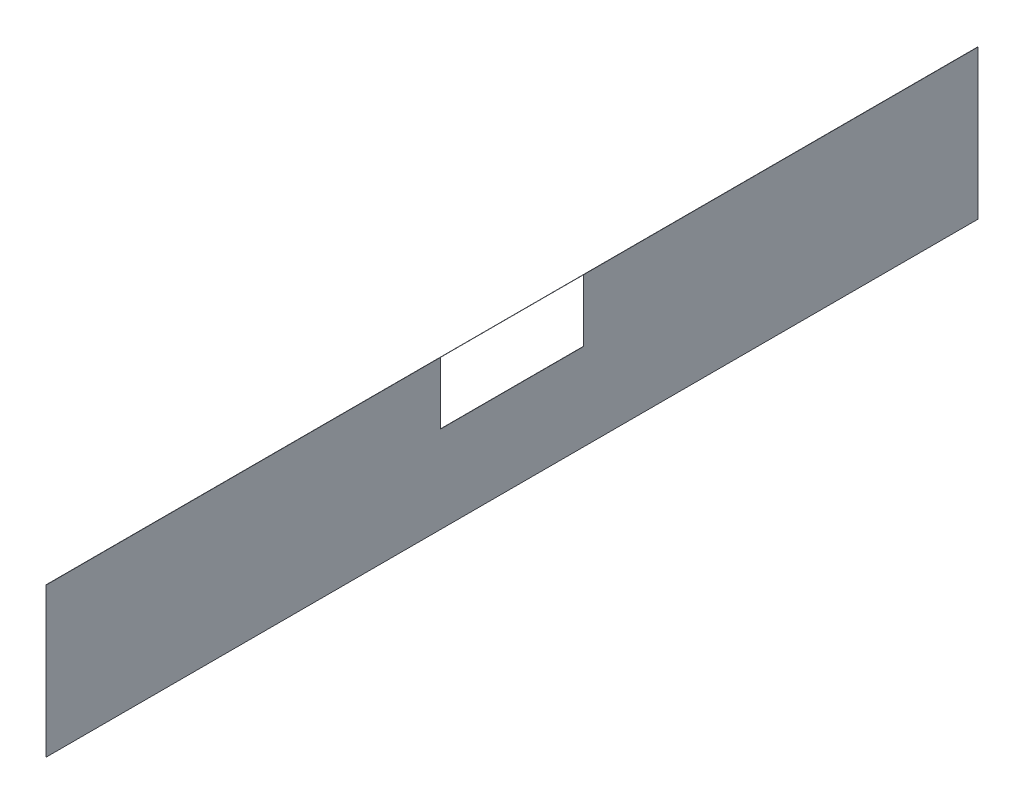
ISO-10303-21;
HEADER;
FILE_DESCRIPTION(('STEP AP214'),'2;1');
FILE_NAME('part.step','',(''),(''),'','','');
FILE_SCHEMA(('AUTOMOTIVE_DESIGN { 1 0 10303 214 1 1 1 1 }'));
ENDSEC;
DATA;
#1=APPLICATION_CONTEXT('core data for automotive mechanical design processes');
#2=APPLICATION_PROTOCOL_DEFINITION('international standard','automotive_design',2000,#1);
#3=PRODUCT_CONTEXT('',#1,'mechanical');
#4=PRODUCT('Part','Part','',(#3));
#5=PRODUCT_RELATED_PRODUCT_CATEGORY('part','',(#4));
#6=PRODUCT_DEFINITION_FORMATION('','',#4);
#7=PRODUCT_DEFINITION_CONTEXT('part definition',#1,'design');
#8=PRODUCT_DEFINITION('design','',#6,#7);
#9=PRODUCT_DEFINITION_SHAPE('','',#8);
#10=(LENGTH_UNIT() NAMED_UNIT(*) SI_UNIT(.MILLI.,.METRE.));
#11=(NAMED_UNIT(*) PLANE_ANGLE_UNIT() SI_UNIT($,.RADIAN.));
#12=(NAMED_UNIT(*) SI_UNIT($,.STERADIAN.) SOLID_ANGLE_UNIT());
#13=UNCERTAINTY_MEASURE_WITH_UNIT(LENGTH_MEASURE(1.E-05),#10,'distance_accuracy_value','');
#14=(GEOMETRIC_REPRESENTATION_CONTEXT(3) GLOBAL_UNCERTAINTY_ASSIGNED_CONTEXT((#13)) GLOBAL_UNIT_ASSIGNED_CONTEXT((#10,
#11,#12)) REPRESENTATION_CONTEXT('',''));
#15=CARTESIAN_POINT('',(0.,0.,0.));
#16=DIRECTION('',(0.,0.,1.));
#17=DIRECTION('',(1.,0.,0.));
#18=AXIS2_PLACEMENT_3D('',#15,#16,#17);
#19=CARTESIAN_POINT('',(-125.4032,60.,-150.));
#20=DIRECTION('',(0.,0.,-1.));
#21=DIRECTION('',(-1.,0.,0.));
#22=AXIS2_PLACEMENT_3D('',#19,#20,#21);
#23=PLANE('',#22);
#24=DIRECTION('',(1.,0.,0.));
#25=VECTOR('',#24,1.);
#26=CARTESIAN_POINT('',(-135.327,12.,-150.));
#27=LINE('',#26,#25);
#28=CARTESIAN_POINT('',(-125.4032,12.,-150.));
#29=VERTEX_POINT('',#28);
#30=CARTESIAN_POINT('',(-125.327,12.,-150.));
#31=VERTEX_POINT('',#30);
#32=EDGE_CURVE('E139',#29,#31,#27,.T.);
#33=ORIENTED_EDGE('',*,*,#32,.F.);
#34=DIRECTION('',(0.,1.,-2.77555756156204E-12));
#35=VECTOR('',#34,1.);
#36=CARTESIAN_POINT('',(-125.4032,60.01,-150.));
#37=LINE('',#36,#35);
#38=CARTESIAN_POINT('',(-125.4032,60.01,-150.));
#39=VERTEX_POINT('',#38);
#40=EDGE_CURVE('E148',#29,#39,#37,.T.);
#41=ORIENTED_EDGE('',*,*,#40,.T.);
#42=DIRECTION('',(1.,0.,0.));
#43=VECTOR('',#42,1.);
#44=CARTESIAN_POINT('',(-125.4032,60.01,-150.));
#45=LINE('',#44,#43);
#46=CARTESIAN_POINT('',(-125.327,60.01,-150.));
#47=VERTEX_POINT('',#46);
#48=EDGE_CURVE('E157',#39,#47,#45,.T.);
#49=ORIENTED_EDGE('',*,*,#48,.T.);
#50=DIRECTION('',(0.,1.,0.));
#51=VECTOR('',#50,1.);
#52=CARTESIAN_POINT('',(-125.327,60.,-150.));
#53=LINE('',#52,#51);
#54=EDGE_CURVE('E151',#31,#47,#53,.T.);
#55=ORIENTED_EDGE('',*,*,#54,.F.);
#56=EDGE_LOOP('',(#33,#41,#49,#55));
#57=FACE_BOUND('',#56,.T.);
#58=ADVANCED_FACE('F45',(#57),#23,.T.);
#59=CARTESIAN_POINT('',(-125.4032,60.,150.));
#60=DIRECTION('',(0.,0.,1.));
#61=DIRECTION('',(1.,0.,0.));
#62=AXIS2_PLACEMENT_3D('',#59,#60,#61);
#63=PLANE('',#62);
#64=DIRECTION('',(1.,0.,0.));
#65=VECTOR('',#64,1.);
#66=CARTESIAN_POINT('',(-135.327,12.,150.));
#67=LINE('',#66,#65);
#68=CARTESIAN_POINT('',(-125.4032,12.,150.));
#69=VERTEX_POINT('',#68);
#70=CARTESIAN_POINT('',(-125.327,12.,150.));
#71=VERTEX_POINT('',#70);
#72=EDGE_CURVE('E140',#69,#71,#67,.T.);
#73=ORIENTED_EDGE('',*,*,#72,.T.);
#74=DIRECTION('',(0.,-1.,0.));
#75=VECTOR('',#74,1.);
#76=CARTESIAN_POINT('',(-125.327,60.,150.));
#77=LINE('',#76,#75);
#78=CARTESIAN_POINT('',(-125.327,60.01,150.));
#79=VERTEX_POINT('',#78);
#80=EDGE_CURVE('E160',#79,#71,#77,.T.);
#81=ORIENTED_EDGE('',*,*,#80,.F.);
#82=DIRECTION('',(1.,0.,0.));
#83=VECTOR('',#82,1.);
#84=CARTESIAN_POINT('',(-125.4032,60.01,150.));
#85=LINE('',#84,#83);
#86=CARTESIAN_POINT('',(-125.4032,60.01,150.));
#87=VERTEX_POINT('',#86);
#88=EDGE_CURVE('E164',#87,#79,#85,.T.);
#89=ORIENTED_EDGE('',*,*,#88,.F.);
#90=DIRECTION('',(0.,-1.,0.));
#91=VECTOR('',#90,1.);
#92=CARTESIAN_POINT('',(-125.4032,60.,150.));
#93=LINE('',#92,#91);
#94=EDGE_CURVE('E154',#87,#69,#93,.T.);
#95=ORIENTED_EDGE('',*,*,#94,.T.);
#96=EDGE_LOOP('',(#73,#81,#89,#95));
#97=FACE_BOUND('',#96,.T.);
#98=ADVANCED_FACE('F193',(#97),#63,.T.);
#99=CARTESIAN_POINT('',(-125.4032,60.01,150.));
#100=DIRECTION('',(0.,1.,0.));
#101=DIRECTION('',(0.,0.,1.));
#102=AXIS2_PLACEMENT_3D('',#99,#100,#101);
#103=PLANE('',#102);
#104=DIRECTION('',(0.,0.,1.));
#105=VECTOR('',#104,1.);
#106=CARTESIAN_POINT('',(-125.327,60.01,150.));
#107=LINE('',#106,#105);
#108=EDGE_CURVE('E147',#47,#79,#107,.T.);
#109=ORIENTED_EDGE('',*,*,#108,.F.);
#110=ORIENTED_EDGE('',*,*,#48,.F.);
#111=DIRECTION('',(0.,0.,1.));
#112=VECTOR('',#111,1.);
#113=CARTESIAN_POINT('',(-125.4032,60.01,150.));
#114=LINE('',#113,#112);
#115=EDGE_CURVE('E150',#39,#87,#114,.T.);
#116=ORIENTED_EDGE('',*,*,#115,.T.);
#117=ORIENTED_EDGE('',*,*,#88,.T.);
#118=EDGE_LOOP('',(#109,#110,#116,#117));
#119=FACE_BOUND('',#118,.T.);
#120=ADVANCED_FACE('F47',(#119),#103,.T.);
#121=CARTESIAN_POINT('',(-125.4032,0.,0.));
#122=DIRECTION('',(1.,0.,0.));
#123=DIRECTION('',(0.,0.,-1.));
#124=AXIS2_PLACEMENT_3D('',#121,#122,#123);
#125=PLANE('',#124);
#126=DIRECTION('',(0.,1.,0.));
#127=VECTOR('',#126,1.);
#128=CARTESIAN_POINT('',(-125.4032,40.001,23.));
#129=LINE('',#128,#127);
#130=CARTESIAN_POINT('',(-125.4032,40.001,23.));
#131=VERTEX_POINT('',#130);
#132=CARTESIAN_POINT('',(-125.4032,60.001,23.));
#133=VERTEX_POINT('',#132);
#134=EDGE_CURVE('E121',#131,#133,#129,.T.);
#135=ORIENTED_EDGE('',*,*,#134,.F.);
#136=DIRECTION('',(0.,0.,1.));
#137=VECTOR('',#136,1.);
#138=CARTESIAN_POINT('',(-125.4032,40.001,-23.));
#139=LINE('',#138,#137);
#140=CARTESIAN_POINT('',(-125.4032,40.001,-23.));
#141=VERTEX_POINT('',#140);
#142=EDGE_CURVE('E60',#141,#131,#139,.T.);
#143=ORIENTED_EDGE('',*,*,#142,.F.);
#144=DIRECTION('',(0.,-1.,0.));
#145=VECTOR('',#144,1.);
#146=CARTESIAN_POINT('',(-125.4032,60.001,-23.));
#147=LINE('',#146,#145);
#148=CARTESIAN_POINT('',(-125.4032,60.001,-23.));
#149=VERTEX_POINT('',#148);
#150=EDGE_CURVE('E128',#149,#141,#147,.T.);
#151=ORIENTED_EDGE('',*,*,#150,.F.);
#152=DIRECTION('',(0.,0.,-1.));
#153=VECTOR('',#152,1.);
#154=CARTESIAN_POINT('',(-125.4032,60.001,-23.));
#155=LINE('',#154,#153);
#156=EDGE_CURVE('E112',#133,#149,#155,.T.);
#157=ORIENTED_EDGE('',*,*,#156,.F.);
#158=EDGE_LOOP('',(#135,#143,#151,#157));
#159=FACE_BOUND('',#158,.T.);
#160=ORIENTED_EDGE('',*,*,#40,.F.);
#161=DIRECTION('',(0.,0.,1.));
#162=VECTOR('',#161,1.);
#163=CARTESIAN_POINT('',(-125.4032,12.,0.));
#164=LINE('',#163,#162);
#165=EDGE_CURVE('E143',#29,#69,#164,.T.);
#166=ORIENTED_EDGE('',*,*,#165,.T.);
#167=ORIENTED_EDGE('',*,*,#94,.F.);
#168=ORIENTED_EDGE('',*,*,#115,.F.);
#169=EDGE_LOOP('',(#160,#166,#167,#168));
#170=FACE_BOUND('',#169,.T.);
#171=ADVANCED_FACE('F125',(#159,#170),#125,.F.);
#172=CARTESIAN_POINT('',(-125.327,0.,0.));
#173=DIRECTION('',(1.,0.,0.));
#174=DIRECTION('',(0.,0.,-1.));
#175=AXIS2_PLACEMENT_3D('',#172,#173,#174);
#176=PLANE('',#175);
#177=DIRECTION('',(0.,0.,-1.));
#178=VECTOR('',#177,1.);
#179=CARTESIAN_POINT('',(-125.327,40.001,0.));
#180=LINE('',#179,#178);
#181=CARTESIAN_POINT('',(-125.327,40.001,23.));
#182=VERTEX_POINT('',#181);
#183=CARTESIAN_POINT('',(-125.327,40.001,-23.));
#184=VERTEX_POINT('',#183);
#185=EDGE_CURVE('E11',#182,#184,#180,.T.);
#186=ORIENTED_EDGE('',*,*,#185,.F.);
#187=DIRECTION('',(0.,-1.,0.));
#188=VECTOR('',#187,1.);
#189=CARTESIAN_POINT('',(-125.327,0.,23.));
#190=LINE('',#189,#188);
#191=CARTESIAN_POINT('',(-125.327,60.001,23.));
#192=VERTEX_POINT('',#191);
#193=EDGE_CURVE('E167',#192,#182,#190,.T.);
#194=ORIENTED_EDGE('',*,*,#193,.F.);
#195=DIRECTION('',(0.,0.,1.));
#196=VECTOR('',#195,1.);
#197=CARTESIAN_POINT('',(-125.327,60.001,0.));
#198=LINE('',#197,#196);
#199=CARTESIAN_POINT('',(-125.327,60.001,-23.));
#200=VERTEX_POINT('',#199);
#201=EDGE_CURVE('E115',#200,#192,#198,.T.);
#202=ORIENTED_EDGE('',*,*,#201,.F.);
#203=DIRECTION('',(0.,1.,0.));
#204=VECTOR('',#203,1.);
#205=CARTESIAN_POINT('',(-125.327,0.,-23.));
#206=LINE('',#205,#204);
#207=EDGE_CURVE('E53',#184,#200,#206,.T.);
#208=ORIENTED_EDGE('',*,*,#207,.F.);
#209=EDGE_LOOP('',(#186,#194,#202,#208));
#210=FACE_BOUND('',#209,.T.);
#211=DIRECTION('',(0.,0.,1.));
#212=VECTOR('',#211,1.);
#213=CARTESIAN_POINT('',(-125.327,12.,150.));
#214=LINE('',#213,#212);
#215=EDGE_CURVE('E135',#31,#71,#214,.T.);
#216=ORIENTED_EDGE('',*,*,#215,.F.);
#217=ORIENTED_EDGE('',*,*,#54,.T.);
#218=ORIENTED_EDGE('',*,*,#108,.T.);
#219=ORIENTED_EDGE('',*,*,#80,.T.);
#220=EDGE_LOOP('',(#216,#217,#218,#219));
#221=FACE_BOUND('',#220,.T.);
#222=ADVANCED_FACE('F177',(#210,#221),#176,.T.);
#223=CARTESIAN_POINT('',(-135.327,12.,150.));
#224=DIRECTION('',(0.,1.,0.));
#225=DIRECTION('',(-1.,0.,0.));
#226=AXIS2_PLACEMENT_3D('',#223,#224,#225);
#227=PLANE('',#226);
#228=ORIENTED_EDGE('',*,*,#32,.T.);
#229=ORIENTED_EDGE('',*,*,#215,.T.);
#230=ORIENTED_EDGE('',*,*,#72,.F.);
#231=ORIENTED_EDGE('',*,*,#165,.F.);
#232=EDGE_LOOP('',(#228,#229,#230,#231));
#233=FACE_BOUND('',#232,.T.);
#234=ADVANCED_FACE('F181',(#233),#227,.F.);
#235=CARTESIAN_POINT('',(-115.4032,40.001,-23.));
#236=DIRECTION('',(0.,-1.,0.));
#237=DIRECTION('',(0.,0.,-1.));
#238=AXIS2_PLACEMENT_3D('',#235,#236,#237);
#239=PLANE('',#238);
#240=ORIENTED_EDGE('',*,*,#185,.T.);
#241=DIRECTION('',(-1.,0.,0.));
#242=VECTOR('',#241,1.);
#243=CARTESIAN_POINT('',(-115.4032,40.001,-23.));
#244=LINE('',#243,#242);
#245=EDGE_CURVE('E133',#184,#141,#244,.T.);
#246=ORIENTED_EDGE('',*,*,#245,.T.);
#247=ORIENTED_EDGE('',*,*,#142,.T.);
#248=DIRECTION('',(-1.,0.,0.));
#249=VECTOR('',#248,1.);
#250=CARTESIAN_POINT('',(-115.4032,40.001,23.));
#251=LINE('',#250,#249);
#252=EDGE_CURVE('E118',#182,#131,#251,.T.);
#253=ORIENTED_EDGE('',*,*,#252,.F.);
#254=EDGE_LOOP('',(#240,#246,#247,#253));
#255=FACE_BOUND('',#254,.T.);
#256=ADVANCED_FACE('F179',(#255),#239,.F.);
#257=CARTESIAN_POINT('',(-115.4032,60.001,-23.));
#258=DIRECTION('',(0.,0.,-1.));
#259=DIRECTION('',(-1.,0.,0.));
#260=AXIS2_PLACEMENT_3D('',#257,#258,#259);
#261=PLANE('',#260);
#262=ORIENTED_EDGE('',*,*,#207,.T.);
#263=DIRECTION('',(-1.,0.,0.));
#264=VECTOR('',#263,1.);
#265=CARTESIAN_POINT('',(-115.4032,60.001,-23.));
#266=LINE('',#265,#264);
#267=EDGE_CURVE('E117',#200,#149,#266,.T.);
#268=ORIENTED_EDGE('',*,*,#267,.T.);
#269=ORIENTED_EDGE('',*,*,#150,.T.);
#270=ORIENTED_EDGE('',*,*,#245,.F.);
#271=EDGE_LOOP('',(#262,#268,#269,#270));
#272=FACE_BOUND('',#271,.T.);
#273=ADVANCED_FACE('F174',(#272),#261,.F.);
#274=CARTESIAN_POINT('',(-115.4032,60.001,-23.));
#275=DIRECTION('',(0.,1.,0.));
#276=DIRECTION('',(-1.,0.,0.));
#277=AXIS2_PLACEMENT_3D('',#274,#275,#276);
#278=PLANE('',#277);
#279=ORIENTED_EDGE('',*,*,#201,.T.);
#280=DIRECTION('',(-1.,0.,0.));
#281=VECTOR('',#280,1.);
#282=CARTESIAN_POINT('',(-115.4032,60.001,23.));
#283=LINE('',#282,#281);
#284=EDGE_CURVE('E68',#192,#133,#283,.T.);
#285=ORIENTED_EDGE('',*,*,#284,.T.);
#286=ORIENTED_EDGE('',*,*,#156,.T.);
#287=ORIENTED_EDGE('',*,*,#267,.F.);
#288=EDGE_LOOP('',(#279,#285,#286,#287));
#289=FACE_BOUND('',#288,.T.);
#290=ADVANCED_FACE('F109',(#289),#278,.F.);
#291=CARTESIAN_POINT('',(-115.4032,40.001,23.));
#292=DIRECTION('',(0.,0.,1.));
#293=DIRECTION('',(1.,0.,0.));
#294=AXIS2_PLACEMENT_3D('',#291,#292,#293);
#295=PLANE('',#294);
#296=ORIENTED_EDGE('',*,*,#193,.T.);
#297=ORIENTED_EDGE('',*,*,#252,.T.);
#298=ORIENTED_EDGE('',*,*,#134,.T.);
#299=ORIENTED_EDGE('',*,*,#284,.F.);
#300=EDGE_LOOP('',(#296,#297,#298,#299));
#301=FACE_BOUND('',#300,.T.);
#302=ADVANCED_FACE('F122',(#301),#295,.F.);
#303=CLOSED_SHELL('',(#58,#98,#120,#171,#222,#234,#256,#273,#290,#302));
#304=MANIFOLD_SOLID_BREP('B2',#303);
#305=ADVANCED_BREP_SHAPE_REPRESENTATION('',(#18,#304),#14);
#306=SHAPE_DEFINITION_REPRESENTATION(#9,#305);
ENDSEC;
END-ISO-10303-21;
